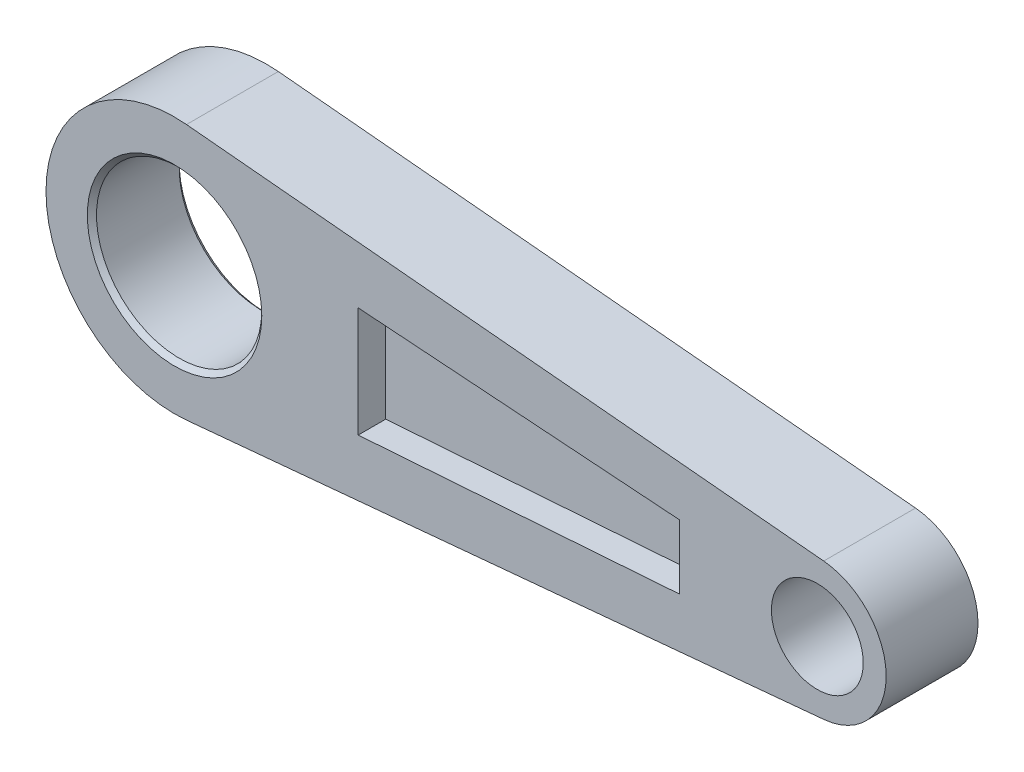
ISO-10303-21;
HEADER;
FILE_DESCRIPTION(('STEP AP214'),'2;1');
FILE_NAME('part.step','',(''),(''),'','','');
FILE_SCHEMA(('AUTOMOTIVE_DESIGN { 1 0 10303 214 1 1 1 1 }'));
ENDSEC;
DATA;
#1=APPLICATION_CONTEXT('core data for automotive mechanical design processes');
#2=APPLICATION_PROTOCOL_DEFINITION('international standard','automotive_design',2000,#1);
#3=PRODUCT_CONTEXT('',#1,'mechanical');
#4=PRODUCT('Part','Part','',(#3));
#5=PRODUCT_RELATED_PRODUCT_CATEGORY('part','',(#4));
#6=PRODUCT_DEFINITION_FORMATION('','',#4);
#7=PRODUCT_DEFINITION_CONTEXT('part definition',#1,'design');
#8=PRODUCT_DEFINITION('design','',#6,#7);
#9=PRODUCT_DEFINITION_SHAPE('','',#8);
#10=(LENGTH_UNIT() NAMED_UNIT(*) SI_UNIT(.MILLI.,.METRE.));
#11=(NAMED_UNIT(*) PLANE_ANGLE_UNIT() SI_UNIT($,.RADIAN.));
#12=(NAMED_UNIT(*) SI_UNIT($,.STERADIAN.) SOLID_ANGLE_UNIT());
#13=UNCERTAINTY_MEASURE_WITH_UNIT(LENGTH_MEASURE(1.E-05),#10,'distance_accuracy_value','');
#14=(GEOMETRIC_REPRESENTATION_CONTEXT(3) GLOBAL_UNCERTAINTY_ASSIGNED_CONTEXT((#13)) GLOBAL_UNIT_ASSIGNED_CONTEXT((#10,
#11,#12)) REPRESENTATION_CONTEXT('',''));
#15=CARTESIAN_POINT('',(0.,0.,0.));
#16=DIRECTION('',(0.,0.,1.));
#17=DIRECTION('',(1.,0.,0.));
#18=AXIS2_PLACEMENT_3D('',#15,#16,#17);
#19=CARTESIAN_POINT('',(0.,0.,-10.));
#20=DIRECTION('',(0.,0.,1.));
#21=DIRECTION('',(1.,0.,0.));
#22=AXIS2_PLACEMENT_3D('',#19,#20,#21);
#23=PLANE('',#22);
#24=CARTESIAN_POINT('',(0.,0.,-10.));
#25=DIRECTION('',(0.,0.,1.));
#26=DIRECTION('',(1.,0.,0.));
#27=AXIS2_PLACEMENT_3D('',#24,#25,#26);
#28=CIRCLE('',#27,19.);
#29=CARTESIAN_POINT('',(19.,0.,-10.));
#30=VERTEX_POINT('',#29);
#31=EDGE_CURVE('E272',#30,#30,#28,.T.);
#32=ORIENTED_EDGE('',*,*,#31,.T.);
#33=EDGE_LOOP('',(#32));
#34=FACE_BOUND('',#33,.T.);
#35=CARTESIAN_POINT('',(0.,0.,-10.));
#36=DIRECTION('',(0.,0.,1.));
#37=DIRECTION('',(1.,0.,0.));
#38=AXIS2_PLACEMENT_3D('',#35,#36,#37);
#39=CIRCLE('',#38,28.);
#40=CARTESIAN_POINT('',(2.6,27.8790243731735,-10.));
#41=VERTEX_POINT('',#40);
#42=CARTESIAN_POINT('',(2.6,-27.8790243731735,-10.));
#43=VERTEX_POINT('',#42);
#44=EDGE_CURVE('E228',#41,#43,#39,.T.);
#45=ORIENTED_EDGE('',*,*,#44,.F.);
#46=DIRECTION('',(-0.995679441899052,0.0928571428571428,0.));
#47=VECTOR('',#46,1.);
#48=CARTESIAN_POINT('',(141.392857142857,14.9351916284858,-10.));
#49=LINE('',#48,#47);
#50=CARTESIAN_POINT('',(141.392857142857,14.9351916284858,-10.));
#51=VERTEX_POINT('',#50);
#52=EDGE_CURVE('E237',#51,#41,#49,.T.);
#53=ORIENTED_EDGE('',*,*,#52,.F.);
#54=CARTESIAN_POINT('',(140.,0.,-10.));
#55=DIRECTION('',(0.,0.,1.));
#56=DIRECTION('',(1.,0.,0.));
#57=AXIS2_PLACEMENT_3D('',#54,#55,#56);
#58=CIRCLE('',#57,15.);
#59=CARTESIAN_POINT('',(141.392857142857,-14.9351916284858,-10.));
#60=VERTEX_POINT('',#59);
#61=EDGE_CURVE('E253',#60,#51,#58,.T.);
#62=ORIENTED_EDGE('',*,*,#61,.F.);
#63=DIRECTION('',(0.995679441899052,0.0928571428571428,0.));
#64=VECTOR('',#63,1.);
#65=CARTESIAN_POINT('',(2.6,-27.8790243731735,-10.));
#66=LINE('',#65,#64);
#67=EDGE_CURVE('E250',#43,#60,#66,.T.);
#68=ORIENTED_EDGE('',*,*,#67,.F.);
#69=EDGE_LOOP('',(#45,#53,#62,#68));
#70=FACE_BOUND('',#69,.T.);
#71=CARTESIAN_POINT('',(140.,0.,-10.));
#72=DIRECTION('',(0.,0.,1.));
#73=DIRECTION('',(1.,0.,0.));
#74=AXIS2_PLACEMENT_3D('',#71,#72,#73);
#75=CIRCLE('',#74,10.);
#76=CARTESIAN_POINT('',(150.,0.,-10.));
#77=VERTEX_POINT('',#76);
#78=EDGE_CURVE('E224',#77,#77,#75,.T.);
#79=ORIENTED_EDGE('',*,*,#78,.T.);
#80=EDGE_LOOP('',(#79));
#81=FACE_BOUND('',#80,.T.);
#82=DIRECTION('',(0.997458699830735,0.0712470499879096,0.));
#83=VECTOR('',#82,1.);
#84=CARTESIAN_POINT('',(110.,-7.,-10.));
#85=LINE('',#84,#83);
#86=CARTESIAN_POINT('',(40.,-12.,-10.));
#87=VERTEX_POINT('',#86);
#88=CARTESIAN_POINT('',(110.,-7.,-10.));
#89=VERTEX_POINT('',#88);
#90=EDGE_CURVE('E76',#87,#89,#85,.T.);
#91=ORIENTED_EDGE('',*,*,#90,.T.);
#92=DIRECTION('',(0.,1.,0.));
#93=VECTOR('',#92,1.);
#94=CARTESIAN_POINT('',(110.,7.,-10.));
#95=LINE('',#94,#93);
#96=CARTESIAN_POINT('',(110.,7.,-10.));
#97=VERTEX_POINT('',#96);
#98=EDGE_CURVE('E171',#89,#97,#95,.T.);
#99=ORIENTED_EDGE('',*,*,#98,.T.);
#100=DIRECTION('',(-0.997458699830735,0.0712470499879096,0.));
#101=VECTOR('',#100,1.);
#102=CARTESIAN_POINT('',(40.,12.,-10.));
#103=LINE('',#102,#101);
#104=CARTESIAN_POINT('',(40.,12.,-10.));
#105=VERTEX_POINT('',#104);
#106=EDGE_CURVE('E307',#97,#105,#103,.T.);
#107=ORIENTED_EDGE('',*,*,#106,.T.);
#108=DIRECTION('',(0.,-1.,0.));
#109=VECTOR('',#108,1.);
#110=CARTESIAN_POINT('',(40.,-12.,-10.));
#111=LINE('',#110,#109);
#112=EDGE_CURVE('E167',#105,#87,#111,.T.);
#113=ORIENTED_EDGE('',*,*,#112,.T.);
#114=EDGE_LOOP('',(#91,#99,#107,#113));
#115=FACE_BOUND('',#114,.T.);
#116=ADVANCED_FACE('F53',(#34,#70,#81,#115),#23,.F.);
#117=CARTESIAN_POINT('',(0.,0.,10.));
#118=DIRECTION('',(0.,0.,-1.));
#119=DIRECTION('',(-1.,0.,0.));
#120=AXIS2_PLACEMENT_3D('',#117,#118,#119);
#121=CYLINDRICAL_SURFACE('',#120,28.);
#122=ORIENTED_EDGE('',*,*,#44,.T.);
#123=DIRECTION('',(0.,0.,-1.));
#124=VECTOR('',#123,1.);
#125=CARTESIAN_POINT('',(2.6,-27.8790243731735,10.));
#126=LINE('',#125,#124);
#127=CARTESIAN_POINT('',(2.6,-27.8790243731735,10.));
#128=VERTEX_POINT('',#127);
#129=EDGE_CURVE('E268',#128,#43,#126,.T.);
#130=ORIENTED_EDGE('',*,*,#129,.F.);
#131=CARTESIAN_POINT('',(0.,0.,10.));
#132=DIRECTION('',(0.,0.,1.));
#133=DIRECTION('',(1.,0.,0.));
#134=AXIS2_PLACEMENT_3D('',#131,#132,#133);
#135=CIRCLE('',#134,28.);
#136=CARTESIAN_POINT('',(2.6,27.8790243731735,10.));
#137=VERTEX_POINT('',#136);
#138=EDGE_CURVE('E232',#137,#128,#135,.T.);
#139=ORIENTED_EDGE('',*,*,#138,.F.);
#140=DIRECTION('',(0.,0.,-1.));
#141=VECTOR('',#140,1.);
#142=CARTESIAN_POINT('',(2.6,27.8790243731735,10.));
#143=LINE('',#142,#141);
#144=EDGE_CURVE('E246',#137,#41,#143,.T.);
#145=ORIENTED_EDGE('',*,*,#144,.T.);
#146=EDGE_LOOP('',(#122,#130,#139,#145));
#147=FACE_BOUND('',#146,.T.);
#148=ADVANCED_FACE('F294',(#147),#121,.T.);
#149=CARTESIAN_POINT('',(2.6,-27.8790243731735,10.));
#150=DIRECTION('',(-0.0928571428571428,0.995679441899052,0.));
#151=DIRECTION('',(-0.995679441899052,-0.0928571428571428,0.));
#152=AXIS2_PLACEMENT_3D('',#149,#150,#151);
#153=PLANE('',#152);
#154=ORIENTED_EDGE('',*,*,#67,.T.);
#155=DIRECTION('',(0.,0.,-1.));
#156=VECTOR('',#155,1.);
#157=CARTESIAN_POINT('',(141.392857142857,-14.9351916284858,10.));
#158=LINE('',#157,#156);
#159=CARTESIAN_POINT('',(141.392857142857,-14.9351916284858,10.));
#160=VERTEX_POINT('',#159);
#161=EDGE_CURVE('E264',#160,#60,#158,.T.);
#162=ORIENTED_EDGE('',*,*,#161,.F.);
#163=DIRECTION('',(0.995679441899052,0.0928571428571428,0.));
#164=VECTOR('',#163,1.);
#165=CARTESIAN_POINT('',(2.6,-27.8790243731735,10.));
#166=LINE('',#165,#164);
#167=EDGE_CURVE('E236',#128,#160,#166,.T.);
#168=ORIENTED_EDGE('',*,*,#167,.F.);
#169=ORIENTED_EDGE('',*,*,#129,.T.);
#170=EDGE_LOOP('',(#154,#162,#168,#169));
#171=FACE_BOUND('',#170,.T.);
#172=ADVANCED_FACE('F413',(#171),#153,.F.);
#173=CARTESIAN_POINT('',(140.,0.,10.));
#174=DIRECTION('',(0.,0.,-1.));
#175=DIRECTION('',(-1.,0.,0.));
#176=AXIS2_PLACEMENT_3D('',#173,#174,#175);
#177=CYLINDRICAL_SURFACE('',#176,15.);
#178=ORIENTED_EDGE('',*,*,#61,.T.);
#179=DIRECTION('',(0.,0.,-1.));
#180=VECTOR('',#179,1.);
#181=CARTESIAN_POINT('',(141.392857142857,14.9351916284858,10.));
#182=LINE('',#181,#180);
#183=CARTESIAN_POINT('',(141.392857142857,14.9351916284858,10.));
#184=VERTEX_POINT('',#183);
#185=EDGE_CURVE('E260',#184,#51,#182,.T.);
#186=ORIENTED_EDGE('',*,*,#185,.F.);
#187=CARTESIAN_POINT('',(140.,0.,10.));
#188=DIRECTION('',(0.,0.,1.));
#189=DIRECTION('',(1.,0.,0.));
#190=AXIS2_PLACEMENT_3D('',#187,#188,#189);
#191=CIRCLE('',#190,15.);
#192=EDGE_CURVE('E240',#160,#184,#191,.T.);
#193=ORIENTED_EDGE('',*,*,#192,.F.);
#194=ORIENTED_EDGE('',*,*,#161,.T.);
#195=EDGE_LOOP('',(#178,#186,#193,#194));
#196=FACE_BOUND('',#195,.T.);
#197=ADVANCED_FACE('F408',(#196),#177,.T.);
#198=CARTESIAN_POINT('',(141.392857142857,14.9351916284858,10.));
#199=DIRECTION('',(-0.0928571428571428,-0.995679441899052,0.));
#200=DIRECTION('',(0.995679441899052,-0.0928571428571428,0.));
#201=AXIS2_PLACEMENT_3D('',#198,#199,#200);
#202=PLANE('',#201);
#203=ORIENTED_EDGE('',*,*,#52,.T.);
#204=ORIENTED_EDGE('',*,*,#144,.F.);
#205=DIRECTION('',(-0.995679441899052,0.0928571428571428,0.));
#206=VECTOR('',#205,1.);
#207=CARTESIAN_POINT('',(141.392857142857,14.9351916284858,10.));
#208=LINE('',#207,#206);
#209=EDGE_CURVE('E243',#184,#137,#208,.T.);
#210=ORIENTED_EDGE('',*,*,#209,.F.);
#211=ORIENTED_EDGE('',*,*,#185,.T.);
#212=EDGE_LOOP('',(#203,#204,#210,#211));
#213=FACE_BOUND('',#212,.T.);
#214=ADVANCED_FACE('F400',(#213),#202,.F.);
#215=CARTESIAN_POINT('',(0.,0.,10.));
#216=DIRECTION('',(0.,0.,1.));
#217=DIRECTION('',(1.,0.,0.));
#218=AXIS2_PLACEMENT_3D('',#215,#216,#217);
#219=PLANE('',#218);
#220=CARTESIAN_POINT('',(0.,0.,10.));
#221=DIRECTION('',(0.,0.,1.));
#222=DIRECTION('',(1.,0.,0.));
#223=AXIS2_PLACEMENT_3D('',#220,#221,#222);
#224=CIRCLE('',#223,19.);
#225=CARTESIAN_POINT('',(19.,0.,10.));
#226=VERTEX_POINT('',#225);
#227=EDGE_CURVE('E11',#226,#226,#224,.F.);
#228=ORIENTED_EDGE('',*,*,#227,.T.);
#229=EDGE_LOOP('',(#228));
#230=FACE_BOUND('',#229,.T.);
#231=DIRECTION('',(0.997458699830735,0.0712470499879096,0.));
#232=VECTOR('',#231,1.);
#233=CARTESIAN_POINT('',(110.,-7.,10.));
#234=LINE('',#233,#232);
#235=CARTESIAN_POINT('',(40.,-12.,10.));
#236=VERTEX_POINT('',#235);
#237=CARTESIAN_POINT('',(110.,-7.,10.));
#238=VERTEX_POINT('',#237);
#239=EDGE_CURVE('E84',#236,#238,#234,.T.);
#240=ORIENTED_EDGE('',*,*,#239,.F.);
#241=DIRECTION('',(0.,-1.,0.));
#242=VECTOR('',#241,1.);
#243=CARTESIAN_POINT('',(40.,-12.,10.));
#244=LINE('',#243,#242);
#245=CARTESIAN_POINT('',(40.,12.,10.));
#246=VERTEX_POINT('',#245);
#247=EDGE_CURVE('E189',#246,#236,#244,.T.);
#248=ORIENTED_EDGE('',*,*,#247,.F.);
#249=DIRECTION('',(-0.997458699830735,0.0712470499879096,0.));
#250=VECTOR('',#249,1.);
#251=CARTESIAN_POINT('',(40.,12.,10.));
#252=LINE('',#251,#250);
#253=CARTESIAN_POINT('',(110.,7.,10.));
#254=VERTEX_POINT('',#253);
#255=EDGE_CURVE('E205',#254,#246,#252,.T.);
#256=ORIENTED_EDGE('',*,*,#255,.F.);
#257=DIRECTION('',(0.,1.,0.));
#258=VECTOR('',#257,1.);
#259=CARTESIAN_POINT('',(110.,7.,10.));
#260=LINE('',#259,#258);
#261=EDGE_CURVE('E177',#238,#254,#260,.T.);
#262=ORIENTED_EDGE('',*,*,#261,.F.);
#263=EDGE_LOOP('',(#240,#248,#256,#262));
#264=FACE_BOUND('',#263,.T.);
#265=CARTESIAN_POINT('',(140.,0.,10.));
#266=DIRECTION('',(0.,0.,1.));
#267=DIRECTION('',(1.,0.,0.));
#268=AXIS2_PLACEMENT_3D('',#265,#266,#267);
#269=CIRCLE('',#268,10.);
#270=CARTESIAN_POINT('',(150.,0.,10.));
#271=VERTEX_POINT('',#270);
#272=EDGE_CURVE('E215',#271,#271,#269,.T.);
#273=ORIENTED_EDGE('',*,*,#272,.F.);
#274=EDGE_LOOP('',(#273));
#275=FACE_BOUND('',#274,.T.);
#276=ORIENTED_EDGE('',*,*,#138,.T.);
#277=ORIENTED_EDGE('',*,*,#167,.T.);
#278=ORIENTED_EDGE('',*,*,#192,.T.);
#279=ORIENTED_EDGE('',*,*,#209,.T.);
#280=EDGE_LOOP('',(#276,#277,#278,#279));
#281=FACE_BOUND('',#280,.T.);
#282=ADVANCED_FACE('F396',(#230,#264,#275,#281),#219,.T.);
#283=CARTESIAN_POINT('',(0.,0.,-10.));
#284=DIRECTION('',(0.,0.,1.));
#285=DIRECTION('',(1.,0.,0.));
#286=AXIS2_PLACEMENT_3D('',#283,#284,#285);
#287=CYLINDRICAL_SURFACE('',#286,18.);
#288=CARTESIAN_POINT('',(18.,0.,-2.));
#289=CARTESIAN_POINT('',(17.9999985855436,0.111970632349519,-1.99999518717274));
#290=CARTESIAN_POINT('',(17.9989441411048,0.22401360296951,-1.99056525489512));
#291=CARTESIAN_POINT('',(17.9948391595619,0.444988473846702,-1.95309247157582));
#292=CARTESIAN_POINT('',(17.9917864712715,0.553916889117786,-1.92502956094916));
#293=CARTESIAN_POINT('',(17.9840293073923,0.765431079070291,-1.85112204481784));
#294=CARTESIAN_POINT('',(17.9793258774716,0.868020820737628,-1.8052886941403));
#295=CARTESIAN_POINT('',(17.9687919810869,1.06403053009986,-1.69716438580146));
#296=CARTESIAN_POINT('',(17.9629617258869,1.1574522117349,-1.63487651233084));
#297=CARTESIAN_POINT('',(17.9507977181856,1.33290575747026,-1.49531794987183));
#298=CARTESIAN_POINT('',(17.9444620831364,1.4148915795421,-1.41798953514322));
#299=CARTESIAN_POINT('',(17.9320167832537,1.56475003710051,-1.2506685239635));
#300=CARTESIAN_POINT('',(17.9259071293129,1.63262199299226,-1.16067531804146));
#301=CARTESIAN_POINT('',(17.9145866794937,1.7524930181623,-0.970286071769773));
#302=CARTESIAN_POINT('',(17.9093782965755,1.80444975542339,-0.869863222950149));
#303=CARTESIAN_POINT('',(17.9004741803531,1.89074517800796,-0.661650539312929));
#304=CARTESIAN_POINT('',(17.8967784014,1.92508439501976,-0.553860926931999));
#305=CARTESIAN_POINT('',(17.8913354423153,1.97503194492644,-0.334448002135696));
#306=CARTESIAN_POINT('',(17.8895802517469,1.99071729842217,-0.222842424929062));
#307=CARTESIAN_POINT('',(17.8881925066123,2.00315006003506,0.00142986183008502));
#308=CARTESIAN_POINT('',(17.8885598839559,1.99989807564483,0.114096537227774));
#309=CARTESIAN_POINT('',(17.891368441014,1.97461184427901,0.336759474971588));
#310=CARTESIAN_POINT('',(17.8938003012309,1.95266200172973,0.446765456674598));
#311=CARTESIAN_POINT('',(17.9004492717341,1.89073461157689,0.661522625388757));
#312=CARTESIAN_POINT('',(17.904666411201,1.85075676930152,0.766273726476568));
#313=CARTESIAN_POINT('',(17.9144214425039,1.75381606079451,0.967812423163108));
#314=CARTESIAN_POINT('',(17.9199622158801,1.6968160688148,1.06458201601582));
#315=CARTESIAN_POINT('',(17.9317378723191,1.56747570663675,1.24721365073087));
#316=CARTESIAN_POINT('',(17.9379727804753,1.49513478176794,1.33307529802335));
#317=CARTESIAN_POINT('',(17.9504756897929,1.33669614893956,1.49194398430861));
#318=CARTESIAN_POINT('',(17.9567436860931,1.25052560566827,1.56487840522475));
#319=CARTESIAN_POINT('',(17.9685745710182,1.06712581996098,1.69525838167234));
#320=CARTESIAN_POINT('',(17.9741374585434,0.969896560277035,1.75270391304576));
#321=CARTESIAN_POINT('',(17.9839338102592,0.767086635535504,1.85047376476476));
#322=CARTESIAN_POINT('',(17.9881669603705,0.661504004801704,1.89079404097506));
#323=CARTESIAN_POINT('',(17.9948238450129,0.445009755639361,1.95311377504167));
#324=CARTESIAN_POINT('',(17.997247646395,0.334098334257908,1.97511390978633));
#325=CARTESIAN_POINT('',(18.0000041106556,0.110723331894269,2.00007590171753));
#326=CARTESIAN_POINT('',(18.0003477720089,-0.00172892889089261,2.00313789379621));
#327=CARTESIAN_POINT('',(17.998934812043,-0.225544988687161,1.99040020748693));
#328=CARTESIAN_POINT('',(17.9971782258895,-0.33690880589132,1.97460084490708));
#329=CARTESIAN_POINT('',(17.9917690933051,-0.555095059423332,1.92467205954415));
#330=CARTESIAN_POINT('',(17.9881214344582,-0.661928438561836,1.89058988188252));
#331=CARTESIAN_POINT('',(17.9793390034163,-0.868362270126896,1.80511172227189));
#332=CARTESIAN_POINT('',(17.9742041905801,-0.967962524792293,1.75371526714896));
#333=CARTESIAN_POINT('',(17.9629935700227,-1.15755326511746,1.63482170892903));
#334=CARTESIAN_POINT('',(17.9569139780361,-1.24750253139102,1.56725923906018));
#335=CARTESIAN_POINT('',(17.9445071585437,-1.41481983480219,1.41804470166563));
#336=CARTESIAN_POINT('',(17.938179923334,-1.49218748015557,1.33639219554766));
#337=CARTESIAN_POINT('',(17.925957484036,-1.63249622432816,1.16087671093394));
#338=CARTESIAN_POINT('',(17.920064336427,-1.69537132537921,1.06696080952172));
#339=CARTESIAN_POINT('',(17.9094097287311,-1.80445556005008,0.869843716507564));
#340=CARTESIAN_POINT('',(17.9046482500845,-1.85066496700075,0.766642677224086));
#341=CARTESIAN_POINT('',(17.8968094822665,-1.92499712101143,0.554105541283379));
#342=CARTESIAN_POINT('',(17.8937286188355,-1.95315827481128,0.444783014252419));
#343=CARTESIAN_POINT('',(17.8895891957456,-1.99071877766797,0.222924852258367));
#344=CARTESIAN_POINT('',(17.8885305631698,-2.00011880320655,0.110389333296549));
#345=CARTESIAN_POINT('',(17.8885572584665,-1.99987957341679,-0.114044155065053));
#346=CARTESIAN_POINT('',(17.8896309120887,-1.99034399043058,-0.225942250680952));
#347=CARTESIAN_POINT('',(17.8937762295707,-1.9527225008048,-0.446535738325605));
#348=CARTESIAN_POINT('',(17.8968478949167,-1.92463658036714,-0.555231127972063));
#349=CARTESIAN_POINT('',(17.9046397451111,-1.85074191262564,-0.766327510509217));
#350=CARTESIAN_POINT('',(17.9093595695852,-1.80493703938195,-0.868729873635424));
#351=CARTESIAN_POINT('',(17.9199166120206,-1.69691508787252,-1.0644104934481));
#352=CARTESIAN_POINT('',(17.9257538322538,-1.63469797623759,-1.15768873158296));
#353=CARTESIAN_POINT('',(17.9379262794022,-1.49522995253707,-1.33300424612643));
#354=CARTESIAN_POINT('',(17.944263963574,-1.41790170900318,-1.41497983547593));
#355=CARTESIAN_POINT('',(17.9567010614173,-1.25056419248413,-1.5648338722108));
#356=CARTESIAN_POINT('',(17.962800418056,-1.16055190760651,-1.63270896185917));
#357=CARTESIAN_POINT('',(17.9740935209669,-0.970094486774868,-1.75260433035013));
#358=CARTESIAN_POINT('',(17.9792844558708,-0.869618446416091,-1.80457574973094));
#359=CARTESIAN_POINT('',(17.9881463543356,-0.66136849516123,-1.89083749244483));
#360=CARTESIAN_POINT('',(17.9918190049356,-0.55360283994444,-1.92514745073418));
#361=CARTESIAN_POINT('',(17.9963232552591,-0.371040239312598,-1.96669916146577));
#362=CARTESIAN_POINT('',(17.9976954860037,-0.297404134861362,-1.97916954843922));
#363=CARTESIAN_POINT('',(17.9995343271896,-0.149189389902707,-1.99582154886399));
#364=CARTESIAN_POINT('',(18.000000942512,-0.0746107544775069,-2.00000320698978));
#365=CARTESIAN_POINT('',(18.,0.,-2.));
#366=B_SPLINE_CURVE_WITH_KNOTS('',3,(#288,#289,#290,#291,#292,#293,#294,#295,#296,#297,#298,
#299,#300,#301,#302,#303,#304,#305,#306,#307,#308,#309,#310,#311,#312,#313,#314,#315,#316,#317,
#318,#319,#320,#321,#322,#323,#324,#325,#326,#327,#328,#329,#330,#331,#332,#333,#334,#335,#336,
#337,#338,#339,#340,#341,#342,#343,#344,#345,#346,#347,#348,#349,#350,#351,#352,#353,#354,#355,
#356,#357,#358,#359,#360,#361,#362,#363,#364,#365),.UNSPECIFIED.,.T.,.F.,(4,2,2,2,2,2,2,2,2,2,2,
2,2,2,2,2,2,2,2,2,2,2,2,2,2,2,2,2,2,2,2,2,2,2,2,2,2,2,4),(0.,0.335639414270807,
0.671640752838988,1.00742963320074,1.34315561881719,1.68019649784365,2.01725360192296,
2.35519959306228,2.69313538455338,3.02967096220247,3.36619574415512,3.70120941343134,
4.03622855878184,4.37198379333011,4.70775116959619,5.0453487253329,5.3829468076176,
5.72062456954608,6.05828985448105,6.39416820670406,6.73004093517319,7.06504987759405,
7.40006797606269,7.73646430887643,8.07287111486782,8.41078088557856,8.74868511404414,
9.08586787252136,9.42303847276942,9.75836815539861,10.0936980874527,10.4289547445926,
10.7642120833782,11.1012322946639,11.4383326684529,11.7764585228658,12.1142076528796,
12.3378595549845,12.5615102516508),.UNSPECIFIED.);
#367=CARTESIAN_POINT('',(18.,0.,-2.));
#368=VERTEX_POINT('',#367);
#369=EDGE_CURVE('E58',#368,#368,#366,.T.);
#370=ORIENTED_EDGE('',*,*,#369,.T.);
#371=EDGE_LOOP('',(#370));
#372=FACE_BOUND('',#371,.T.);
#373=CARTESIAN_POINT('',(0.,0.,-8.99999999999997));
#374=DIRECTION('',(0.,0.,1.));
#375=DIRECTION('',(1.,0.,0.));
#376=AXIS2_PLACEMENT_3D('',#373,#374,#375);
#377=CIRCLE('',#376,18.);
#378=CARTESIAN_POINT('',(18.,0.,-8.99999999999997));
#379=VERTEX_POINT('',#378);
#380=EDGE_CURVE('E69',#379,#379,#377,.F.);
#381=ORIENTED_EDGE('',*,*,#380,.T.);
#382=EDGE_LOOP('',(#381));
#383=FACE_BOUND('',#382,.T.);
#384=CARTESIAN_POINT('',(0.,0.,9.00000000000002));
#385=DIRECTION('',(0.,0.,1.));
#386=DIRECTION('',(1.,0.,0.));
#387=AXIS2_PLACEMENT_3D('',#384,#385,#386);
#388=CIRCLE('',#387,18.);
#389=CARTESIAN_POINT('',(18.,0.,9.00000000000002));
#390=VERTEX_POINT('',#389);
#391=EDGE_CURVE('E276',#390,#390,#388,.T.);
#392=ORIENTED_EDGE('',*,*,#391,.T.);
#393=EDGE_LOOP('',(#392));
#394=FACE_BOUND('',#393,.T.);
#395=ADVANCED_FACE('F284',(#372,#383,#394),#287,.F.);
#396=CARTESIAN_POINT('',(140.,0.,-10.));
#397=DIRECTION('',(0.,0.,1.));
#398=DIRECTION('',(1.,0.,0.));
#399=AXIS2_PLACEMENT_3D('',#396,#397,#398);
#400=CYLINDRICAL_SURFACE('',#399,10.);
#401=ORIENTED_EDGE('',*,*,#78,.F.);
#402=EDGE_LOOP('',(#401));
#403=FACE_BOUND('',#402,.T.);
#404=ORIENTED_EDGE('',*,*,#272,.T.);
#405=EDGE_LOOP('',(#404));
#406=FACE_BOUND('',#405,.T.);
#407=ADVANCED_FACE('F388',(#403,#406),#400,.F.);
#408=CARTESIAN_POINT('',(110.,-7.,4.));
#409=DIRECTION('',(0.0712470499879096,-0.997458699830735,0.));
#410=DIRECTION('',(0.997458699830735,0.0712470499879096,0.));
#411=AXIS2_PLACEMENT_3D('',#408,#409,#410);
#412=PLANE('',#411);
#413=ORIENTED_EDGE('',*,*,#239,.T.);
#414=DIRECTION('',(0.,0.,1.));
#415=VECTOR('',#414,1.);
#416=CARTESIAN_POINT('',(110.,-7.,4.));
#417=LINE('',#416,#415);
#418=CARTESIAN_POINT('',(110.,-7.,4.));
#419=VERTEX_POINT('',#418);
#420=EDGE_CURVE('E200',#419,#238,#417,.T.);
#421=ORIENTED_EDGE('',*,*,#420,.F.);
#422=DIRECTION('',(0.997458699830735,0.0712470499879096,0.));
#423=VECTOR('',#422,1.);
#424=CARTESIAN_POINT('',(110.,-7.,4.));
#425=LINE('',#424,#423);
#426=CARTESIAN_POINT('',(40.,-12.,4.));
#427=VERTEX_POINT('',#426);
#428=EDGE_CURVE('E184',#427,#419,#425,.T.);
#429=ORIENTED_EDGE('',*,*,#428,.F.);
#430=DIRECTION('',(0.,0.,1.));
#431=VECTOR('',#430,1.);
#432=CARTESIAN_POINT('',(40.,-12.,4.));
#433=LINE('',#432,#431);
#434=EDGE_CURVE('E212',#427,#236,#433,.T.);
#435=ORIENTED_EDGE('',*,*,#434,.T.);
#436=EDGE_LOOP('',(#413,#421,#429,#435));
#437=FACE_BOUND('',#436,.T.);
#438=ADVANCED_FACE('F377',(#437),#412,.F.);
#439=CARTESIAN_POINT('',(40.,-12.,4.));
#440=DIRECTION('',(-1.,0.,0.));
#441=DIRECTION('',(0.,0.,1.));
#442=AXIS2_PLACEMENT_3D('',#439,#440,#441);
#443=PLANE('',#442);
#444=ORIENTED_EDGE('',*,*,#247,.T.);
#445=ORIENTED_EDGE('',*,*,#434,.F.);
#446=DIRECTION('',(0.,-1.,0.));
#447=VECTOR('',#446,1.);
#448=CARTESIAN_POINT('',(40.,-12.,4.));
#449=LINE('',#448,#447);
#450=CARTESIAN_POINT('',(40.,12.,4.));
#451=VERTEX_POINT('',#450);
#452=EDGE_CURVE('E197',#451,#427,#449,.T.);
#453=ORIENTED_EDGE('',*,*,#452,.F.);
#454=DIRECTION('',(0.,0.,1.));
#455=VECTOR('',#454,1.);
#456=CARTESIAN_POINT('',(40.,12.,4.));
#457=LINE('',#456,#455);
#458=EDGE_CURVE('E216',#451,#246,#457,.T.);
#459=ORIENTED_EDGE('',*,*,#458,.T.);
#460=EDGE_LOOP('',(#444,#445,#453,#459));
#461=FACE_BOUND('',#460,.T.);
#462=ADVANCED_FACE('F371',(#461),#443,.F.);
#463=CARTESIAN_POINT('',(40.,12.,4.));
#464=DIRECTION('',(0.0712470499879096,0.997458699830735,0.));
#465=DIRECTION('',(-0.997458699830735,0.0712470499879096,0.));
#466=AXIS2_PLACEMENT_3D('',#463,#464,#465);
#467=PLANE('',#466);
#468=ORIENTED_EDGE('',*,*,#255,.T.);
#469=ORIENTED_EDGE('',*,*,#458,.F.);
#470=DIRECTION('',(-0.997458699830735,0.0712470499879096,0.));
#471=VECTOR('',#470,1.);
#472=CARTESIAN_POINT('',(40.,12.,4.));
#473=LINE('',#472,#471);
#474=CARTESIAN_POINT('',(110.,7.,4.));
#475=VERTEX_POINT('',#474);
#476=EDGE_CURVE('E193',#475,#451,#473,.T.);
#477=ORIENTED_EDGE('',*,*,#476,.F.);
#478=DIRECTION('',(0.,0.,1.));
#479=VECTOR('',#478,1.);
#480=CARTESIAN_POINT('',(110.,7.,4.));
#481=LINE('',#480,#479);
#482=EDGE_CURVE('E219',#475,#254,#481,.T.);
#483=ORIENTED_EDGE('',*,*,#482,.T.);
#484=EDGE_LOOP('',(#468,#469,#477,#483));
#485=FACE_BOUND('',#484,.T.);
#486=ADVANCED_FACE('F376',(#485),#467,.F.);
#487=CARTESIAN_POINT('',(110.,7.,4.));
#488=DIRECTION('',(1.,0.,0.));
#489=DIRECTION('',(0.,0.,-1.));
#490=AXIS2_PLACEMENT_3D('',#487,#488,#489);
#491=PLANE('',#490);
#492=ORIENTED_EDGE('',*,*,#261,.T.);
#493=ORIENTED_EDGE('',*,*,#482,.F.);
#494=DIRECTION('',(0.,1.,0.));
#495=VECTOR('',#494,1.);
#496=CARTESIAN_POINT('',(110.,7.,4.));
#497=LINE('',#496,#495);
#498=EDGE_CURVE('E188',#419,#475,#497,.T.);
#499=ORIENTED_EDGE('',*,*,#498,.F.);
#500=ORIENTED_EDGE('',*,*,#420,.T.);
#501=EDGE_LOOP('',(#492,#493,#499,#500));
#502=FACE_BOUND('',#501,.T.);
#503=ADVANCED_FACE('F368',(#502),#491,.F.);
#504=CARTESIAN_POINT('',(0.,0.,4.));
#505=DIRECTION('',(0.,0.,-1.));
#506=DIRECTION('',(-1.,0.,0.));
#507=AXIS2_PLACEMENT_3D('',#504,#505,#506);
#508=PLANE('',#507);
#509=ORIENTED_EDGE('',*,*,#428,.T.);
#510=ORIENTED_EDGE('',*,*,#498,.T.);
#511=ORIENTED_EDGE('',*,*,#476,.T.);
#512=ORIENTED_EDGE('',*,*,#452,.T.);
#513=EDGE_LOOP('',(#509,#510,#511,#512));
#514=FACE_BOUND('',#513,.T.);
#515=ADVANCED_FACE('F364',(#514),#508,.F.);
#516=CARTESIAN_POINT('',(110.,-7.,-4.));
#517=DIRECTION('',(-0.0712470499879096,0.997458699830735,0.));
#518=DIRECTION('',(-0.997458699830735,-0.0712470499879096,0.));
#519=AXIS2_PLACEMENT_3D('',#516,#517,#518);
#520=PLANE('',#519);
#521=ORIENTED_EDGE('',*,*,#90,.F.);
#522=DIRECTION('',(0.,0.,-1.));
#523=VECTOR('',#522,1.);
#524=CARTESIAN_POINT('',(40.,-12.,-4.));
#525=LINE('',#524,#523);
#526=CARTESIAN_POINT('',(40.,-12.,-4.));
#527=VERTEX_POINT('',#526);
#528=EDGE_CURVE('E165',#527,#87,#525,.T.);
#529=ORIENTED_EDGE('',*,*,#528,.F.);
#530=DIRECTION('',(0.997458699830735,0.0712470499879096,0.));
#531=VECTOR('',#530,1.);
#532=CARTESIAN_POINT('',(110.,-7.,-4.));
#533=LINE('',#532,#531);
#534=CARTESIAN_POINT('',(110.,-7.,-4.));
#535=VERTEX_POINT('',#534);
#536=EDGE_CURVE('E156',#527,#535,#533,.T.);
#537=ORIENTED_EDGE('',*,*,#536,.T.);
#538=DIRECTION('',(0.,0.,-1.));
#539=VECTOR('',#538,1.);
#540=CARTESIAN_POINT('',(110.,-7.,-4.));
#541=LINE('',#540,#539);
#542=EDGE_CURVE('E164',#535,#89,#541,.T.);
#543=ORIENTED_EDGE('',*,*,#542,.T.);
#544=EDGE_LOOP('',(#521,#529,#537,#543));
#545=FACE_BOUND('',#544,.T.);
#546=ADVANCED_FACE('F163',(#545),#520,.T.);
#547=CARTESIAN_POINT('',(110.,7.,-4.));
#548=DIRECTION('',(-1.,0.,0.));
#549=DIRECTION('',(0.,0.,1.));
#550=AXIS2_PLACEMENT_3D('',#547,#548,#549);
#551=PLANE('',#550);
#552=ORIENTED_EDGE('',*,*,#98,.F.);
#553=ORIENTED_EDGE('',*,*,#542,.F.);
#554=DIRECTION('',(0.,1.,0.));
#555=VECTOR('',#554,1.);
#556=CARTESIAN_POINT('',(110.,7.,-4.));
#557=LINE('',#556,#555);
#558=CARTESIAN_POINT('',(110.,7.,-4.));
#559=VERTEX_POINT('',#558);
#560=EDGE_CURVE('E152',#535,#559,#557,.T.);
#561=ORIENTED_EDGE('',*,*,#560,.T.);
#562=DIRECTION('',(0.,0.,-1.));
#563=VECTOR('',#562,1.);
#564=CARTESIAN_POINT('',(110.,7.,-4.));
#565=LINE('',#564,#563);
#566=EDGE_CURVE('E173',#559,#97,#565,.T.);
#567=ORIENTED_EDGE('',*,*,#566,.T.);
#568=EDGE_LOOP('',(#552,#553,#561,#567));
#569=FACE_BOUND('',#568,.T.);
#570=ADVANCED_FACE('F169',(#569),#551,.T.);
#571=CARTESIAN_POINT('',(40.,12.,-4.));
#572=DIRECTION('',(-0.0712470499879096,-0.997458699830735,0.));
#573=DIRECTION('',(0.997458699830735,-0.0712470499879096,0.));
#574=AXIS2_PLACEMENT_3D('',#571,#572,#573);
#575=PLANE('',#574);
#576=ORIENTED_EDGE('',*,*,#106,.F.);
#577=ORIENTED_EDGE('',*,*,#566,.F.);
#578=DIRECTION('',(-0.997458699830735,0.0712470499879096,0.));
#579=VECTOR('',#578,1.);
#580=CARTESIAN_POINT('',(40.,12.,-4.));
#581=LINE('',#580,#579);
#582=CARTESIAN_POINT('',(40.,12.,-4.));
#583=VERTEX_POINT('',#582);
#584=EDGE_CURVE('E157',#559,#583,#581,.T.);
#585=ORIENTED_EDGE('',*,*,#584,.T.);
#586=DIRECTION('',(0.,0.,-1.));
#587=VECTOR('',#586,1.);
#588=CARTESIAN_POINT('',(40.,12.,-4.));
#589=LINE('',#588,#587);
#590=EDGE_CURVE('E180',#583,#105,#589,.T.);
#591=ORIENTED_EDGE('',*,*,#590,.T.);
#592=EDGE_LOOP('',(#576,#577,#585,#591));
#593=FACE_BOUND('',#592,.T.);
#594=ADVANCED_FACE('F325',(#593),#575,.T.);
#595=CARTESIAN_POINT('',(40.,-12.,-4.));
#596=DIRECTION('',(1.,0.,0.));
#597=DIRECTION('',(0.,0.,-1.));
#598=AXIS2_PLACEMENT_3D('',#595,#596,#597);
#599=PLANE('',#598);
#600=ORIENTED_EDGE('',*,*,#112,.F.);
#601=ORIENTED_EDGE('',*,*,#590,.F.);
#602=DIRECTION('',(0.,-1.,0.));
#603=VECTOR('',#602,1.);
#604=CARTESIAN_POINT('',(40.,-12.,-4.));
#605=LINE('',#604,#603);
#606=EDGE_CURVE('E313',#583,#527,#605,.T.);
#607=ORIENTED_EDGE('',*,*,#606,.T.);
#608=ORIENTED_EDGE('',*,*,#528,.T.);
#609=EDGE_LOOP('',(#600,#601,#607,#608));
#610=FACE_BOUND('',#609,.T.);
#611=ADVANCED_FACE('F327',(#610),#599,.T.);
#612=CARTESIAN_POINT('',(0.,0.,-4.));
#613=DIRECTION('',(0.,0.,-1.));
#614=DIRECTION('',(-1.,0.,0.));
#615=AXIS2_PLACEMENT_3D('',#612,#613,#614);
#616=PLANE('',#615);
#617=ORIENTED_EDGE('',*,*,#536,.F.);
#618=ORIENTED_EDGE('',*,*,#606,.F.);
#619=ORIENTED_EDGE('',*,*,#584,.F.);
#620=ORIENTED_EDGE('',*,*,#560,.F.);
#621=EDGE_LOOP('',(#617,#618,#619,#620));
#622=FACE_BOUND('',#621,.T.);
#623=ADVANCED_FACE('F154',(#622),#616,.T.);
#624=CARTESIAN_POINT('',(0.,0.,-10.));
#625=DIRECTION('',(0.,0.,-1.));
#626=DIRECTION('',(-1.,0.,0.));
#627=AXIS2_PLACEMENT_3D('',#624,#625,#626);
#628=CONICAL_SURFACE('',#627,19.,0.785398163397441);
#629=ORIENTED_EDGE('',*,*,#380,.F.);
#630=EDGE_LOOP('',(#629));
#631=FACE_BOUND('',#630,.T.);
#632=ORIENTED_EDGE('',*,*,#31,.F.);
#633=EDGE_LOOP('',(#632));
#634=FACE_BOUND('',#633,.T.);
#635=ADVANCED_FACE('F287',(#631,#634),#628,.F.);
#636=CARTESIAN_POINT('',(0.,0.,9.00000000000002));
#637=DIRECTION('',(0.,0.,1.));
#638=DIRECTION('',(1.,0.,0.));
#639=AXIS2_PLACEMENT_3D('',#636,#637,#638);
#640=CONICAL_SURFACE('',#639,18.,0.785398163397441);
#641=ORIENTED_EDGE('',*,*,#227,.F.);
#642=EDGE_LOOP('',(#641));
#643=FACE_BOUND('',#642,.T.);
#644=ORIENTED_EDGE('',*,*,#391,.F.);
#645=EDGE_LOOP('',(#644));
#646=FACE_BOUND('',#645,.T.);
#647=ADVANCED_FACE('F56',(#643,#646),#640,.F.);
#648=CARTESIAN_POINT('',(0.,0.,0.));
#649=DIRECTION('',(1.,0.,0.));
#650=DIRECTION('',(0.,0.,-1.));
#651=AXIS2_PLACEMENT_3D('',#648,#649,#650);
#652=CYLINDRICAL_SURFACE('',#651,2.);
#653=CARTESIAN_POINT('',(25.,0.,0.));
#654=DIRECTION('',(1.,0.,0.));
#655=DIRECTION('',(0.,0.,-1.));
#656=AXIS2_PLACEMENT_3D('',#653,#654,#655);
#657=CIRCLE('',#656,2.);
#658=CARTESIAN_POINT('',(25.,0.,-2.));
#659=VERTEX_POINT('',#658);
#660=EDGE_CURVE('E311',#659,#659,#657,.T.);
#661=ORIENTED_EDGE('',*,*,#660,.T.);
#662=EDGE_LOOP('',(#661));
#663=FACE_BOUND('',#662,.T.);
#664=ORIENTED_EDGE('',*,*,#369,.F.);
#665=EDGE_LOOP('',(#664));
#666=FACE_BOUND('',#665,.T.);
#667=ADVANCED_FACE('F335',(#663,#666),#652,.F.);
#668=CARTESIAN_POINT('',(25.,0.,0.));
#669=DIRECTION('',(1.,0.,0.));
#670=DIRECTION('',(0.,0.,-1.));
#671=AXIS2_PLACEMENT_3D('',#668,#669,#670);
#672=PLANE('',#671);
#673=ORIENTED_EDGE('',*,*,#660,.F.);
#674=EDGE_LOOP('',(#673));
#675=FACE_BOUND('',#674,.T.);
#676=ADVANCED_FACE('F338',(#675),#672,.F.);
#677=CLOSED_SHELL('',(#116,#148,#172,#197,#214,#282,#395,#407,#438,#462,#486,#503,#515,#546,
#570,#594,#611,#623,#635,#647,#667,#676));
#678=MANIFOLD_SOLID_BREP('B2',#677);
#679=ADVANCED_BREP_SHAPE_REPRESENTATION('',(#18,#678),#14);
#680=SHAPE_DEFINITION_REPRESENTATION(#9,#679);
ENDSEC;
END-ISO-10303-21;
